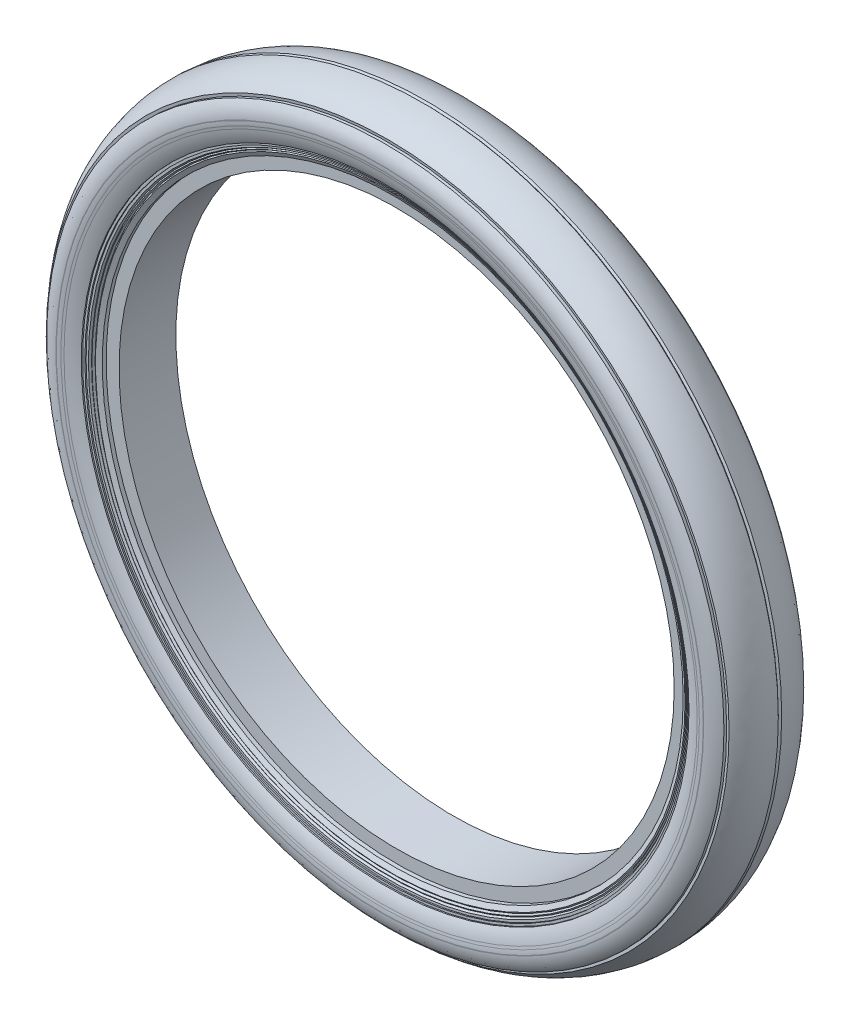
ISO-10303-21;
HEADER;
FILE_DESCRIPTION(('STEP AP214'),'2;1');
FILE_NAME('part.step','',(''),(''),'','','');
FILE_SCHEMA(('AUTOMOTIVE_DESIGN { 1 0 10303 214 1 1 1 1 }'));
ENDSEC;
DATA;
#1=APPLICATION_CONTEXT('core data for automotive mechanical design processes');
#2=APPLICATION_PROTOCOL_DEFINITION('international standard','automotive_design',2000,#1);
#3=PRODUCT_CONTEXT('',#1,'mechanical');
#4=PRODUCT('Part','Part','',(#3));
#5=PRODUCT_RELATED_PRODUCT_CATEGORY('part','',(#4));
#6=PRODUCT_DEFINITION_FORMATION('','',#4);
#7=PRODUCT_DEFINITION_CONTEXT('part definition',#1,'design');
#8=PRODUCT_DEFINITION('design','',#6,#7);
#9=PRODUCT_DEFINITION_SHAPE('','',#8);
#10=(LENGTH_UNIT() NAMED_UNIT(*) SI_UNIT(.MILLI.,.METRE.));
#11=(NAMED_UNIT(*) PLANE_ANGLE_UNIT() SI_UNIT($,.RADIAN.));
#12=(NAMED_UNIT(*) SI_UNIT($,.STERADIAN.) SOLID_ANGLE_UNIT());
#13=UNCERTAINTY_MEASURE_WITH_UNIT(LENGTH_MEASURE(1.E-05),#10,'distance_accuracy_value','');
#14=(GEOMETRIC_REPRESENTATION_CONTEXT(3) GLOBAL_UNCERTAINTY_ASSIGNED_CONTEXT((#13)) GLOBAL_UNIT_ASSIGNED_CONTEXT((#10,
#11,#12)) REPRESENTATION_CONTEXT('',''));
#15=CARTESIAN_POINT('',(0.,0.,0.));
#16=DIRECTION('',(0.,0.,1.));
#17=DIRECTION('',(1.,0.,0.));
#18=AXIS2_PLACEMENT_3D('',#15,#16,#17);
#19=CARTESIAN_POINT('',(0.,250.88266761477,0.));
#20=DIRECTION('',(1.,0.,0.));
#21=DIRECTION('',(0.,0.,1.));
#22=AXIS2_PLACEMENT_3D('',#19,#20,#21);
#23=ELLIPSE('',#22,35.,24.1173323852305);
#24=CARTESIAN_POINT('',(0.,0.,22.));
#25=DIRECTION('',(0.,0.,1.));
#26=AXIS1_PLACEMENT('',#24,#25);
#27=SURFACE_OF_REVOLUTION('',#23,#26);
#28=CARTESIAN_POINT('',(0.,0.,35.));
#29=DIRECTION('',(0.,0.,1.));
#30=DIRECTION('',(1.,0.,0.));
#31=AXIS2_PLACEMENT_3D('',#28,#29,#30);
#32=CIRCLE('',#31,250.88266761477);
#33=CARTESIAN_POINT('',(250.88266761477,0.,35.));
#34=VERTEX_POINT('',#33);
#35=EDGE_CURVE('E12',#34,#34,#32,.T.);
#36=ORIENTED_EDGE('',*,*,#35,.F.);
#37=EDGE_LOOP('',(#36));
#38=FACE_BOUND('',#37,.T.);
#39=CARTESIAN_POINT('',(0.,0.,30.7902092861246));
#40=DIRECTION('',(0.,0.,1.));
#41=DIRECTION('',(1.,0.,0.));
#42=AXIS2_PLACEMENT_3D('',#39,#40,#41);
#43=CIRCLE('',#42,262.350256403838);
#44=CARTESIAN_POINT('',(262.350256403838,0.,30.7902092861246));
#45=VERTEX_POINT('',#44);
#46=EDGE_CURVE('E168',#45,#45,#43,.T.);
#47=ORIENTED_EDGE('',*,*,#46,.T.);
#48=EDGE_LOOP('',(#47));
#49=FACE_BOUND('',#48,.T.);
#50=ADVANCED_FACE('F40',(#38,#49),#27,.T.);
#51=CARTESIAN_POINT('',(0.,250.88266761477,35.));
#52=DIRECTION('',(0.,0.,-1.));
#53=DIRECTION('',(-1.,0.,0.));
#54=AXIS2_PLACEMENT_3D('',#51,#52,#53);
#55=PLANE('',#54);
#56=CARTESIAN_POINT('',(0.,0.,35.));
#57=DIRECTION('',(0.,0.,1.));
#58=DIRECTION('',(1.,0.,0.));
#59=AXIS2_PLACEMENT_3D('',#56,#57,#58);
#60=CIRCLE('',#59,250.537268264597);
#61=CARTESIAN_POINT('',(250.537268264597,0.,35.));
#62=VERTEX_POINT('',#61);
#63=EDGE_CURVE('E47',#62,#62,#60,.T.);
#64=ORIENTED_EDGE('',*,*,#63,.F.);
#65=EDGE_LOOP('',(#64));
#66=FACE_BOUND('',#65,.T.);
#67=ORIENTED_EDGE('',*,*,#35,.T.);
#68=EDGE_LOOP('',(#67));
#69=FACE_BOUND('',#68,.T.);
#70=ADVANCED_FACE('F327',(#66,#69),#55,.F.);
#71=CARTESIAN_POINT('',(0.,0.,15.));
#72=DIRECTION('',(0.,0.,1.));
#73=DIRECTION('',(1.,0.,0.));
#74=AXIS2_PLACEMENT_3D('',#71,#72,#73);
#75=TOROIDAL_SURFACE('',#74,250.537268264597,20.);
#76=CARTESIAN_POINT('',(0.,0.,34.7280906865282));
#77=DIRECTION('',(0.,0.,1.));
#78=DIRECTION('',(1.,0.,0.));
#79=AXIS2_PLACEMENT_3D('',#76,#77,#78);
#80=CIRCLE('',#79,247.250562031281);
#81=CARTESIAN_POINT('',(247.250562031281,0.,34.7280906865282));
#82=VERTEX_POINT('',#81);
#83=EDGE_CURVE('E51',#82,#82,#80,.T.);
#84=ORIENTED_EDGE('',*,*,#83,.F.);
#85=EDGE_LOOP('',(#84));
#86=FACE_BOUND('',#85,.T.);
#87=ORIENTED_EDGE('',*,*,#63,.T.);
#88=EDGE_LOOP('',(#87));
#89=FACE_BOUND('',#88,.T.);
#90=ADVANCED_FACE('F324',(#86,#89),#75,.T.);
#91=CARTESIAN_POINT('',(0.,0.,34.7280906865282));
#92=DIRECTION('',(0.,0.,1.));
#93=DIRECTION('',(1.,0.,0.));
#94=AXIS2_PLACEMENT_3D('',#91,#92,#93);
#95=CONICAL_SURFACE('',#94,247.250562031281,1.40571220299879);
#96=CARTESIAN_POINT('',(0.,0.,34.3955866579208));
#97=DIRECTION('',(0.,0.,1.));
#98=DIRECTION('',(1.,0.,0.));
#99=AXIS2_PLACEMENT_3D('',#96,#97,#98);
#100=CIRCLE('',#99,245.254743371398);
#101=CARTESIAN_POINT('',(245.254743371398,0.,34.3955866579208));
#102=VERTEX_POINT('',#101);
#103=EDGE_CURVE('E55',#102,#102,#100,.T.);
#104=ORIENTED_EDGE('',*,*,#103,.F.);
#105=EDGE_LOOP('',(#104));
#106=FACE_BOUND('',#105,.T.);
#107=ORIENTED_EDGE('',*,*,#83,.T.);
#108=EDGE_LOOP('',(#107));
#109=FACE_BOUND('',#108,.T.);
#110=ADVANCED_FACE('F320',(#106,#109),#95,.F.);
#111=CARTESIAN_POINT('',(0.,0.,4.80345062812692));
#112=DIRECTION('',(0.,0.,1.));
#113=DIRECTION('',(1.,0.,0.));
#114=AXIS2_PLACEMENT_3D('',#111,#112,#113);
#115=TOROIDAL_SURFACE('',#114,250.184802721372,30.0000000000011);
#116=CARTESIAN_POINT('',(0.,0.,30.8890761680604));
#117=DIRECTION('',(0.,0.,1.));
#118=DIRECTION('',(1.,0.,0.));
#119=AXIS2_PLACEMENT_3D('',#116,#117,#118);
#120=CIRCLE('',#119,235.367915727458);
#121=CARTESIAN_POINT('',(235.367915727458,0.,30.8890761680604));
#122=VERTEX_POINT('',#121);
#123=EDGE_CURVE('E60',#122,#122,#120,.T.);
#124=ORIENTED_EDGE('',*,*,#123,.F.);
#125=EDGE_LOOP('',(#124));
#126=FACE_BOUND('',#125,.T.);
#127=ORIENTED_EDGE('',*,*,#103,.T.);
#128=EDGE_LOOP('',(#127));
#129=FACE_BOUND('',#128,.T.);
#130=ADVANCED_FACE('F316',(#126,#129),#115,.T.);
#131=CARTESIAN_POINT('',(0.,0.,22.));
#132=DIRECTION('',(0.,0.,1.));
#133=DIRECTION('',(1.,0.,0.));
#134=AXIS2_PLACEMENT_3D('',#131,#132,#133);
#135=CYLINDRICAL_SURFACE('',#134,235.367915727458);
#136=CARTESIAN_POINT('',(0.,0.,29.88907616806));
#137=DIRECTION('',(0.,0.,1.));
#138=DIRECTION('',(1.,0.,0.));
#139=AXIS2_PLACEMENT_3D('',#136,#137,#138);
#140=CIRCLE('',#139,235.367915727458);
#141=CARTESIAN_POINT('',(235.367915727458,0.,29.88907616806));
#142=VERTEX_POINT('',#141);
#143=EDGE_CURVE('E63',#142,#142,#140,.T.);
#144=ORIENTED_EDGE('',*,*,#143,.F.);
#145=EDGE_LOOP('',(#144));
#146=FACE_BOUND('',#145,.T.);
#147=ORIENTED_EDGE('',*,*,#123,.T.);
#148=EDGE_LOOP('',(#147));
#149=FACE_BOUND('',#148,.T.);
#150=ADVANCED_FACE('F312',(#146,#149),#135,.F.);
#151=CARTESIAN_POINT('',(0.,235.367915727458,29.8890761680604));
#152=DIRECTION('',(0.,0.,-1.));
#153=DIRECTION('',(-1.,0.,0.));
#154=AXIS2_PLACEMENT_3D('',#151,#152,#153);
#155=PLANE('',#154);
#156=CARTESIAN_POINT('',(0.,0.,29.8890761680608));
#157=DIRECTION('',(0.,0.,1.));
#158=DIRECTION('',(1.,0.,0.));
#159=AXIS2_PLACEMENT_3D('',#156,#157,#158);
#160=CIRCLE('',#159,233.60738225301);
#161=CARTESIAN_POINT('',(233.60738225301,0.,29.8890761680608));
#162=VERTEX_POINT('',#161);
#163=EDGE_CURVE('E66',#162,#162,#160,.T.);
#164=ORIENTED_EDGE('',*,*,#163,.F.);
#165=EDGE_LOOP('',(#164));
#166=FACE_BOUND('',#165,.T.);
#167=ORIENTED_EDGE('',*,*,#143,.T.);
#168=EDGE_LOOP('',(#167));
#169=FACE_BOUND('',#168,.T.);
#170=ADVANCED_FACE('F308',(#166,#169),#155,.F.);
#171=CARTESIAN_POINT('',(0.,0.,22.));
#172=DIRECTION('',(0.,0.,1.));
#173=DIRECTION('',(1.,0.,0.));
#174=AXIS2_PLACEMENT_3D('',#171,#172,#173);
#175=CYLINDRICAL_SURFACE('',#174,233.60738225301);
#176=CARTESIAN_POINT('',(0.,0.,28.8890761680608));
#177=DIRECTION('',(0.,0.,1.));
#178=DIRECTION('',(1.,0.,0.));
#179=AXIS2_PLACEMENT_3D('',#176,#177,#178);
#180=CIRCLE('',#179,233.60738225301);
#181=CARTESIAN_POINT('',(233.60738225301,0.,28.8890761680608));
#182=VERTEX_POINT('',#181);
#183=EDGE_CURVE('E69',#182,#182,#180,.T.);
#184=ORIENTED_EDGE('',*,*,#183,.F.);
#185=EDGE_LOOP('',(#184));
#186=FACE_BOUND('',#185,.T.);
#187=ORIENTED_EDGE('',*,*,#163,.T.);
#188=EDGE_LOOP('',(#187));
#189=FACE_BOUND('',#188,.T.);
#190=ADVANCED_FACE('F304',(#186,#189),#175,.F.);
#191=CARTESIAN_POINT('',(0.,233.60738225301,28.8890761680608));
#192=DIRECTION('',(0.,0.,-1.));
#193=DIRECTION('',(-1.,0.,0.));
#194=AXIS2_PLACEMENT_3D('',#191,#192,#193);
#195=PLANE('',#194);
#196=CARTESIAN_POINT('',(0.,0.,28.8890761680609));
#197=DIRECTION('',(0.,0.,1.));
#198=DIRECTION('',(1.,0.,0.));
#199=AXIS2_PLACEMENT_3D('',#196,#197,#198);
#200=CIRCLE('',#199,231.846848778559);
#201=CARTESIAN_POINT('',(231.846848778559,0.,28.8890761680609));
#202=VERTEX_POINT('',#201);
#203=EDGE_CURVE('E72',#202,#202,#200,.T.);
#204=ORIENTED_EDGE('',*,*,#203,.F.);
#205=EDGE_LOOP('',(#204));
#206=FACE_BOUND('',#205,.T.);
#207=ORIENTED_EDGE('',*,*,#183,.T.);
#208=EDGE_LOOP('',(#207));
#209=FACE_BOUND('',#208,.T.);
#210=ADVANCED_FACE('F300',(#206,#209),#195,.F.);
#211=CARTESIAN_POINT('',(0.,0.,28.8890761680609));
#212=DIRECTION('',(0.,0.,1.));
#213=DIRECTION('',(1.,0.,0.));
#214=AXIS2_PLACEMENT_3D('',#211,#212,#213);
#215=CONICAL_SURFACE('',#214,231.846848778559,0.537666373477924);
#216=CARTESIAN_POINT('',(0.,0.,27.3769431462616));
#217=DIRECTION('',(0.,0.,1.));
#218=DIRECTION('',(1.,0.,0.));
#219=AXIS2_PLACEMENT_3D('',#216,#217,#218);
#220=CIRCLE('',#219,230.94522145031);
#221=CARTESIAN_POINT('',(230.94522145031,0.,27.3769431462616));
#222=VERTEX_POINT('',#221);
#223=EDGE_CURVE('E75',#222,#222,#220,.T.);
#224=ORIENTED_EDGE('',*,*,#223,.F.);
#225=EDGE_LOOP('',(#224));
#226=FACE_BOUND('',#225,.T.);
#227=ORIENTED_EDGE('',*,*,#203,.T.);
#228=EDGE_LOOP('',(#227));
#229=FACE_BOUND('',#228,.T.);
#230=ADVANCED_FACE('F296',(#226,#229),#215,.F.);
#231=CARTESIAN_POINT('',(0.,0.,27.3769431462616));
#232=DIRECTION('',(0.,0.,-1.));
#233=DIRECTION('',(-1.,0.,0.));
#234=AXIS2_PLACEMENT_3D('',#231,#232,#233);
#235=CONICAL_SURFACE('',#234,230.94522145031,1.03312995331698);
#236=CARTESIAN_POINT('',(0.,0.,27.8890761680609));
#237=DIRECTION('',(0.,0.,1.));
#238=DIRECTION('',(1.,0.,0.));
#239=AXIS2_PLACEMENT_3D('',#236,#237,#238);
#240=CIRCLE('',#239,230.086315304109);
#241=CARTESIAN_POINT('',(230.086315304109,0.,27.8890761680609));
#242=VERTEX_POINT('',#241);
#243=EDGE_CURVE('E78',#242,#242,#240,.T.);
#244=ORIENTED_EDGE('',*,*,#243,.F.);
#245=EDGE_LOOP('',(#244));
#246=FACE_BOUND('',#245,.T.);
#247=ORIENTED_EDGE('',*,*,#223,.T.);
#248=EDGE_LOOP('',(#247));
#249=FACE_BOUND('',#248,.T.);
#250=ADVANCED_FACE('F292',(#246,#249),#235,.T.);
#251=CARTESIAN_POINT('',(0.,0.,27.8890761680609));
#252=DIRECTION('',(0.,0.,1.));
#253=DIRECTION('',(1.,0.,0.));
#254=AXIS2_PLACEMENT_3D('',#251,#252,#253);
#255=CONICAL_SURFACE('',#254,230.086315304109,0.537666373477914);
#256=CARTESIAN_POINT('',(0.,0.,26.3769431462619));
#257=DIRECTION('',(0.,0.,1.));
#258=DIRECTION('',(1.,0.,0.));
#259=AXIS2_PLACEMENT_3D('',#256,#257,#258);
#260=CIRCLE('',#259,229.18468797586);
#261=CARTESIAN_POINT('',(229.18468797586,0.,26.3769431462619));
#262=VERTEX_POINT('',#261);
#263=EDGE_CURVE('E81',#262,#262,#260,.T.);
#264=ORIENTED_EDGE('',*,*,#263,.F.);
#265=EDGE_LOOP('',(#264));
#266=FACE_BOUND('',#265,.T.);
#267=ORIENTED_EDGE('',*,*,#243,.T.);
#268=EDGE_LOOP('',(#267));
#269=FACE_BOUND('',#268,.T.);
#270=ADVANCED_FACE('F288',(#266,#269),#255,.F.);
#271=CARTESIAN_POINT('',(0.,0.,26.3769431462619));
#272=DIRECTION('',(0.,0.,-1.));
#273=DIRECTION('',(-1.,0.,0.));
#274=AXIS2_PLACEMENT_3D('',#271,#272,#273);
#275=CONICAL_SURFACE('',#274,229.18468797586,1.03312995331694);
#276=CARTESIAN_POINT('',(0.,0.,26.8890761680611));
#277=DIRECTION('',(0.,0.,1.));
#278=DIRECTION('',(1.,0.,0.));
#279=AXIS2_PLACEMENT_3D('',#276,#277,#278);
#280=CIRCLE('',#279,228.325781829658);
#281=CARTESIAN_POINT('',(228.325781829658,0.,26.8890761680611));
#282=VERTEX_POINT('',#281);
#283=EDGE_CURVE('E84',#282,#282,#280,.T.);
#284=ORIENTED_EDGE('',*,*,#283,.F.);
#285=EDGE_LOOP('',(#284));
#286=FACE_BOUND('',#285,.T.);
#287=ORIENTED_EDGE('',*,*,#263,.T.);
#288=EDGE_LOOP('',(#287));
#289=FACE_BOUND('',#288,.T.);
#290=ADVANCED_FACE('F284',(#286,#289),#275,.T.);
#291=CARTESIAN_POINT('',(0.,0.,26.8890761680611));
#292=DIRECTION('',(0.,0.,1.));
#293=DIRECTION('',(1.,0.,0.));
#294=AXIS2_PLACEMENT_3D('',#291,#292,#293);
#295=CONICAL_SURFACE('',#294,228.325781829658,1.05423135013636);
#296=CARTESIAN_POINT('',(0.,0.,25.));
#297=DIRECTION('',(0.,0.,1.));
#298=DIRECTION('',(1.,0.,0.));
#299=AXIS2_PLACEMENT_3D('',#296,#297,#298);
#300=CIRCLE('',#299,225.);
#301=CARTESIAN_POINT('',(225.,0.,25.));
#302=VERTEX_POINT('',#301);
#303=EDGE_CURVE('E87',#302,#302,#300,.T.);
#304=ORIENTED_EDGE('',*,*,#303,.F.);
#305=EDGE_LOOP('',(#304));
#306=FACE_BOUND('',#305,.T.);
#307=ORIENTED_EDGE('',*,*,#283,.T.);
#308=EDGE_LOOP('',(#307));
#309=FACE_BOUND('',#308,.T.);
#310=ADVANCED_FACE('F280',(#306,#309),#295,.F.);
#311=CARTESIAN_POINT('',(0.,0.,22.));
#312=DIRECTION('',(0.,0.,1.));
#313=DIRECTION('',(1.,0.,0.));
#314=AXIS2_PLACEMENT_3D('',#311,#312,#313);
#315=CYLINDRICAL_SURFACE('',#314,225.);
#316=CARTESIAN_POINT('',(0.,0.,22.));
#317=DIRECTION('',(0.,0.,1.));
#318=DIRECTION('',(1.,0.,0.));
#319=AXIS2_PLACEMENT_3D('',#316,#317,#318);
#320=CIRCLE('',#319,225.);
#321=CARTESIAN_POINT('',(225.,0.,22.));
#322=VERTEX_POINT('',#321);
#323=EDGE_CURVE('E90',#322,#322,#320,.T.);
#324=ORIENTED_EDGE('',*,*,#323,.F.);
#325=EDGE_LOOP('',(#324));
#326=FACE_BOUND('',#325,.T.);
#327=ORIENTED_EDGE('',*,*,#303,.T.);
#328=EDGE_LOOP('',(#327));
#329=FACE_BOUND('',#328,.T.);
#330=ADVANCED_FACE('F276',(#326,#329),#315,.F.);
#331=CARTESIAN_POINT('',(0.,215.,22.));
#332=DIRECTION('',(0.,0.,-1.));
#333=DIRECTION('',(-1.,0.,0.));
#334=AXIS2_PLACEMENT_3D('',#331,#332,#333);
#335=PLANE('',#334);
#336=CARTESIAN_POINT('',(0.,0.,22.));
#337=DIRECTION('',(0.,0.,1.));
#338=DIRECTION('',(1.,0.,0.));
#339=AXIS2_PLACEMENT_3D('',#336,#337,#338);
#340=CIRCLE('',#339,215.);
#341=CARTESIAN_POINT('',(215.,0.,22.));
#342=VERTEX_POINT('',#341);
#343=EDGE_CURVE('E93',#342,#342,#340,.T.);
#344=ORIENTED_EDGE('',*,*,#343,.F.);
#345=EDGE_LOOP('',(#344));
#346=FACE_BOUND('',#345,.T.);
#347=ORIENTED_EDGE('',*,*,#323,.T.);
#348=EDGE_LOOP('',(#347));
#349=FACE_BOUND('',#348,.T.);
#350=ADVANCED_FACE('F272',(#346,#349),#335,.F.);
#351=CARTESIAN_POINT('',(0.,0.,22.));
#352=DIRECTION('',(0.,0.,1.));
#353=DIRECTION('',(1.,0.,0.));
#354=AXIS2_PLACEMENT_3D('',#351,#352,#353);
#355=CYLINDRICAL_SURFACE('',#354,215.);
#356=CARTESIAN_POINT('',(0.,0.,-22.));
#357=DIRECTION('',(0.,0.,1.));
#358=DIRECTION('',(1.,0.,0.));
#359=AXIS2_PLACEMENT_3D('',#356,#357,#358);
#360=CIRCLE('',#359,215.);
#361=CARTESIAN_POINT('',(215.,0.,-22.));
#362=VERTEX_POINT('',#361);
#363=EDGE_CURVE('E96',#362,#362,#360,.T.);
#364=ORIENTED_EDGE('',*,*,#363,.F.);
#365=EDGE_LOOP('',(#364));
#366=FACE_BOUND('',#365,.T.);
#367=ORIENTED_EDGE('',*,*,#343,.T.);
#368=EDGE_LOOP('',(#367));
#369=FACE_BOUND('',#368,.T.);
#370=ADVANCED_FACE('F268',(#366,#369),#355,.F.);
#371=CARTESIAN_POINT('',(0.,215.,-22.));
#372=DIRECTION('',(0.,0.,1.));
#373=DIRECTION('',(1.,0.,0.));
#374=AXIS2_PLACEMENT_3D('',#371,#372,#373);
#375=PLANE('',#374);
#376=CARTESIAN_POINT('',(0.,0.,-22.));
#377=DIRECTION('',(0.,0.,1.));
#378=DIRECTION('',(1.,0.,0.));
#379=AXIS2_PLACEMENT_3D('',#376,#377,#378);
#380=CIRCLE('',#379,225.);
#381=CARTESIAN_POINT('',(225.,0.,-22.));
#382=VERTEX_POINT('',#381);
#383=EDGE_CURVE('E99',#382,#382,#380,.T.);
#384=ORIENTED_EDGE('',*,*,#383,.F.);
#385=EDGE_LOOP('',(#384));
#386=FACE_BOUND('',#385,.T.);
#387=ORIENTED_EDGE('',*,*,#363,.T.);
#388=EDGE_LOOP('',(#387));
#389=FACE_BOUND('',#388,.T.);
#390=ADVANCED_FACE('F264',(#386,#389),#375,.F.);
#391=CARTESIAN_POINT('',(0.,0.,22.));
#392=DIRECTION('',(0.,0.,1.));
#393=DIRECTION('',(1.,0.,0.));
#394=AXIS2_PLACEMENT_3D('',#391,#392,#393);
#395=CYLINDRICAL_SURFACE('',#394,225.);
#396=CARTESIAN_POINT('',(0.,0.,-25.));
#397=DIRECTION('',(0.,0.,1.));
#398=DIRECTION('',(1.,0.,0.));
#399=AXIS2_PLACEMENT_3D('',#396,#397,#398);
#400=CIRCLE('',#399,225.);
#401=CARTESIAN_POINT('',(225.,0.,-25.));
#402=VERTEX_POINT('',#401);
#403=EDGE_CURVE('E102',#402,#402,#400,.T.);
#404=ORIENTED_EDGE('',*,*,#403,.F.);
#405=EDGE_LOOP('',(#404));
#406=FACE_BOUND('',#405,.T.);
#407=ORIENTED_EDGE('',*,*,#383,.T.);
#408=EDGE_LOOP('',(#407));
#409=FACE_BOUND('',#408,.T.);
#410=ADVANCED_FACE('F260',(#406,#409),#395,.F.);
#411=CARTESIAN_POINT('',(0.,0.,-25.));
#412=DIRECTION('',(0.,0.,-1.));
#413=DIRECTION('',(-1.,0.,0.));
#414=AXIS2_PLACEMENT_3D('',#411,#412,#413);
#415=CONICAL_SURFACE('',#414,225.,1.05423135013642);
#416=CARTESIAN_POINT('',(0.,0.,-26.8890761680609));
#417=DIRECTION('',(0.,0.,1.));
#418=DIRECTION('',(1.,0.,0.));
#419=AXIS2_PLACEMENT_3D('',#416,#417,#418);
#420=CIRCLE('',#419,228.325781829658);
#421=CARTESIAN_POINT('',(228.325781829658,0.,-26.8890761680609));
#422=VERTEX_POINT('',#421);
#423=EDGE_CURVE('E105',#422,#422,#420,.T.);
#424=ORIENTED_EDGE('',*,*,#423,.F.);
#425=EDGE_LOOP('',(#424));
#426=FACE_BOUND('',#425,.T.);
#427=ORIENTED_EDGE('',*,*,#403,.T.);
#428=EDGE_LOOP('',(#427));
#429=FACE_BOUND('',#428,.T.);
#430=ADVANCED_FACE('F256',(#426,#429),#415,.F.);
#431=CARTESIAN_POINT('',(0.,0.,-26.8890761680609));
#432=DIRECTION('',(0.,0.,1.));
#433=DIRECTION('',(1.,0.,0.));
#434=AXIS2_PLACEMENT_3D('',#431,#432,#433);
#435=CONICAL_SURFACE('',#434,228.325781829658,1.03312995331687);
#436=CARTESIAN_POINT('',(0.,0.,-26.3769431462616));
#437=DIRECTION('',(0.,0.,1.));
#438=DIRECTION('',(1.,0.,0.));
#439=AXIS2_PLACEMENT_3D('',#436,#437,#438);
#440=CIRCLE('',#439,229.18468797586);
#441=CARTESIAN_POINT('',(229.18468797586,0.,-26.3769431462616));
#442=VERTEX_POINT('',#441);
#443=EDGE_CURVE('E108',#442,#442,#440,.T.);
#444=ORIENTED_EDGE('',*,*,#443,.F.);
#445=EDGE_LOOP('',(#444));
#446=FACE_BOUND('',#445,.T.);
#447=ORIENTED_EDGE('',*,*,#423,.T.);
#448=EDGE_LOOP('',(#447));
#449=FACE_BOUND('',#448,.T.);
#450=ADVANCED_FACE('F252',(#446,#449),#435,.T.);
#451=CARTESIAN_POINT('',(0.,0.,-26.3769431462616));
#452=DIRECTION('',(0.,0.,-1.));
#453=DIRECTION('',(-1.,0.,0.));
#454=AXIS2_PLACEMENT_3D('',#451,#452,#453);
#455=CONICAL_SURFACE('',#454,229.18468797586,0.537666373477923);
#456=CARTESIAN_POINT('',(0.,0.,-27.8890761680609));
#457=DIRECTION('',(0.,0.,1.));
#458=DIRECTION('',(1.,0.,0.));
#459=AXIS2_PLACEMENT_3D('',#456,#457,#458);
#460=CIRCLE('',#459,230.086315304109);
#461=CARTESIAN_POINT('',(230.086315304109,0.,-27.8890761680609));
#462=VERTEX_POINT('',#461);
#463=EDGE_CURVE('E111',#462,#462,#460,.T.);
#464=ORIENTED_EDGE('',*,*,#463,.F.);
#465=EDGE_LOOP('',(#464));
#466=FACE_BOUND('',#465,.T.);
#467=ORIENTED_EDGE('',*,*,#443,.T.);
#468=EDGE_LOOP('',(#467));
#469=FACE_BOUND('',#468,.T.);
#470=ADVANCED_FACE('F248',(#466,#469),#455,.F.);
#471=CARTESIAN_POINT('',(0.,0.,-27.8890761680609));
#472=DIRECTION('',(0.,0.,1.));
#473=DIRECTION('',(1.,0.,0.));
#474=AXIS2_PLACEMENT_3D('',#471,#472,#473);
#475=CONICAL_SURFACE('',#474,230.086315304109,1.03312995331698);
#476=CARTESIAN_POINT('',(0.,0.,-27.3769431462617));
#477=DIRECTION('',(0.,0.,1.));
#478=DIRECTION('',(1.,0.,0.));
#479=AXIS2_PLACEMENT_3D('',#476,#477,#478);
#480=CIRCLE('',#479,230.94522145031);
#481=CARTESIAN_POINT('',(230.94522145031,0.,-27.3769431462617));
#482=VERTEX_POINT('',#481);
#483=EDGE_CURVE('E114',#482,#482,#480,.T.);
#484=ORIENTED_EDGE('',*,*,#483,.F.);
#485=EDGE_LOOP('',(#484));
#486=FACE_BOUND('',#485,.T.);
#487=ORIENTED_EDGE('',*,*,#463,.T.);
#488=EDGE_LOOP('',(#487));
#489=FACE_BOUND('',#488,.T.);
#490=ADVANCED_FACE('F244',(#486,#489),#475,.T.);
#491=CARTESIAN_POINT('',(0.,0.,-27.3769431462617));
#492=DIRECTION('',(0.,0.,-1.));
#493=DIRECTION('',(-1.,0.,0.));
#494=AXIS2_PLACEMENT_3D('',#491,#492,#493);
#495=CONICAL_SURFACE('',#494,230.94522145031,0.537666373477923);
#496=CARTESIAN_POINT('',(0.,0.,-28.8890761680609));
#497=DIRECTION('',(0.,0.,1.));
#498=DIRECTION('',(1.,0.,0.));
#499=AXIS2_PLACEMENT_3D('',#496,#497,#498);
#500=CIRCLE('',#499,231.84684877856);
#501=CARTESIAN_POINT('',(231.84684877856,0.,-28.8890761680609));
#502=VERTEX_POINT('',#501);
#503=EDGE_CURVE('E117',#502,#502,#500,.T.);
#504=ORIENTED_EDGE('',*,*,#503,.F.);
#505=EDGE_LOOP('',(#504));
#506=FACE_BOUND('',#505,.T.);
#507=ORIENTED_EDGE('',*,*,#483,.T.);
#508=EDGE_LOOP('',(#507));
#509=FACE_BOUND('',#508,.T.);
#510=ADVANCED_FACE('F240',(#506,#509),#495,.F.);
#511=CARTESIAN_POINT('',(0.,233.60738225301,-28.8890761680609));
#512=DIRECTION('',(0.,0.,1.));
#513=DIRECTION('',(1.,0.,0.));
#514=AXIS2_PLACEMENT_3D('',#511,#512,#513);
#515=PLANE('',#514);
#516=CARTESIAN_POINT('',(0.,0.,-28.8890761680609));
#517=DIRECTION('',(0.,0.,1.));
#518=DIRECTION('',(1.,0.,0.));
#519=AXIS2_PLACEMENT_3D('',#516,#517,#518);
#520=CIRCLE('',#519,233.60738225301);
#521=CARTESIAN_POINT('',(233.60738225301,0.,-28.8890761680609));
#522=VERTEX_POINT('',#521);
#523=EDGE_CURVE('E120',#522,#522,#520,.T.);
#524=ORIENTED_EDGE('',*,*,#523,.F.);
#525=EDGE_LOOP('',(#524));
#526=FACE_BOUND('',#525,.T.);
#527=ORIENTED_EDGE('',*,*,#503,.T.);
#528=EDGE_LOOP('',(#527));
#529=FACE_BOUND('',#528,.T.);
#530=ADVANCED_FACE('F236',(#526,#529),#515,.F.);
#531=CARTESIAN_POINT('',(0.,0.,22.));
#532=DIRECTION('',(0.,0.,1.));
#533=DIRECTION('',(1.,0.,0.));
#534=AXIS2_PLACEMENT_3D('',#531,#532,#533);
#535=CYLINDRICAL_SURFACE('',#534,233.60738225301);
#536=CARTESIAN_POINT('',(0.,0.,-29.8890761680609));
#537=DIRECTION('',(0.,0.,1.));
#538=DIRECTION('',(1.,0.,0.));
#539=AXIS2_PLACEMENT_3D('',#536,#537,#538);
#540=CIRCLE('',#539,233.60738225301);
#541=CARTESIAN_POINT('',(233.60738225301,0.,-29.8890761680609));
#542=VERTEX_POINT('',#541);
#543=EDGE_CURVE('E123',#542,#542,#540,.T.);
#544=ORIENTED_EDGE('',*,*,#543,.F.);
#545=EDGE_LOOP('',(#544));
#546=FACE_BOUND('',#545,.T.);
#547=ORIENTED_EDGE('',*,*,#523,.T.);
#548=EDGE_LOOP('',(#547));
#549=FACE_BOUND('',#548,.T.);
#550=ADVANCED_FACE('F232',(#546,#549),#535,.F.);
#551=CARTESIAN_POINT('',(0.,235.367915727458,-29.8890761680608));
#552=DIRECTION('',(0.,0.,1.));
#553=DIRECTION('',(1.,0.,0.));
#554=AXIS2_PLACEMENT_3D('',#551,#552,#553);
#555=PLANE('',#554);
#556=CARTESIAN_POINT('',(0.,0.,-29.8890761680608));
#557=DIRECTION('',(0.,0.,1.));
#558=DIRECTION('',(1.,0.,0.));
#559=AXIS2_PLACEMENT_3D('',#556,#557,#558);
#560=CIRCLE('',#559,235.367915727458);
#561=CARTESIAN_POINT('',(235.367915727458,0.,-29.8890761680608));
#562=VERTEX_POINT('',#561);
#563=EDGE_CURVE('E126',#562,#562,#560,.T.);
#564=ORIENTED_EDGE('',*,*,#563,.F.);
#565=EDGE_LOOP('',(#564));
#566=FACE_BOUND('',#565,.T.);
#567=ORIENTED_EDGE('',*,*,#543,.T.);
#568=EDGE_LOOP('',(#567));
#569=FACE_BOUND('',#568,.T.);
#570=ADVANCED_FACE('F228',(#566,#569),#555,.F.);
#571=CARTESIAN_POINT('',(0.,0.,22.));
#572=DIRECTION('',(0.,0.,1.));
#573=DIRECTION('',(1.,0.,0.));
#574=AXIS2_PLACEMENT_3D('',#571,#572,#573);
#575=CYLINDRICAL_SURFACE('',#574,235.367915727458);
#576=CARTESIAN_POINT('',(0.,0.,-30.8890761680608));
#577=DIRECTION('',(0.,0.,1.));
#578=DIRECTION('',(1.,0.,0.));
#579=AXIS2_PLACEMENT_3D('',#576,#577,#578);
#580=CIRCLE('',#579,235.367915727458);
#581=CARTESIAN_POINT('',(235.367915727458,0.,-30.8890761680608));
#582=VERTEX_POINT('',#581);
#583=EDGE_CURVE('E129',#582,#582,#580,.T.);
#584=ORIENTED_EDGE('',*,*,#583,.F.);
#585=EDGE_LOOP('',(#584));
#586=FACE_BOUND('',#585,.T.);
#587=ORIENTED_EDGE('',*,*,#563,.T.);
#588=EDGE_LOOP('',(#587));
#589=FACE_BOUND('',#588,.T.);
#590=ADVANCED_FACE('F224',(#586,#589),#575,.F.);
#591=CARTESIAN_POINT('',(0.,0.,-4.80345062812692));
#592=DIRECTION('',(0.,0.,1.));
#593=DIRECTION('',(1.,0.,0.));
#594=AXIS2_PLACEMENT_3D('',#591,#592,#593);
#595=TOROIDAL_SURFACE('',#594,250.184802721372,30.0000000000016);
#596=CARTESIAN_POINT('',(0.,0.,-34.3955866579208));
#597=DIRECTION('',(0.,0.,1.));
#598=DIRECTION('',(1.,0.,0.));
#599=AXIS2_PLACEMENT_3D('',#596,#597,#598);
#600=CIRCLE('',#599,245.254743371398);
#601=CARTESIAN_POINT('',(245.254743371398,0.,-34.3955866579208));
#602=VERTEX_POINT('',#601);
#603=EDGE_CURVE('E132',#602,#602,#600,.T.);
#604=ORIENTED_EDGE('',*,*,#603,.F.);
#605=EDGE_LOOP('',(#604));
#606=FACE_BOUND('',#605,.T.);
#607=ORIENTED_EDGE('',*,*,#583,.T.);
#608=EDGE_LOOP('',(#607));
#609=FACE_BOUND('',#608,.T.);
#610=ADVANCED_FACE('F220',(#606,#609),#595,.T.);
#611=CARTESIAN_POINT('',(0.,0.,-34.3955866579208));
#612=DIRECTION('',(0.,0.,-1.));
#613=DIRECTION('',(-1.,0.,0.));
#614=AXIS2_PLACEMENT_3D('',#611,#612,#613);
#615=CONICAL_SURFACE('',#614,245.254743371398,1.40571220299879);
#616=CARTESIAN_POINT('',(0.,0.,-34.7280906865282));
#617=DIRECTION('',(0.,0.,1.));
#618=DIRECTION('',(1.,0.,0.));
#619=AXIS2_PLACEMENT_3D('',#616,#617,#618);
#620=CIRCLE('',#619,247.250562031281);
#621=CARTESIAN_POINT('',(247.250562031281,0.,-34.7280906865282));
#622=VERTEX_POINT('',#621);
#623=EDGE_CURVE('E135',#622,#622,#620,.T.);
#624=ORIENTED_EDGE('',*,*,#623,.F.);
#625=EDGE_LOOP('',(#624));
#626=FACE_BOUND('',#625,.T.);
#627=ORIENTED_EDGE('',*,*,#603,.T.);
#628=EDGE_LOOP('',(#627));
#629=FACE_BOUND('',#628,.T.);
#630=ADVANCED_FACE('F216',(#626,#629),#615,.F.);
#631=CARTESIAN_POINT('',(0.,0.,-15.));
#632=DIRECTION('',(0.,0.,1.));
#633=DIRECTION('',(1.,0.,0.));
#634=AXIS2_PLACEMENT_3D('',#631,#632,#633);
#635=TOROIDAL_SURFACE('',#634,250.537268264597,20.);
#636=CARTESIAN_POINT('',(0.,0.,-35.));
#637=DIRECTION('',(0.,0.,1.));
#638=DIRECTION('',(1.,0.,0.));
#639=AXIS2_PLACEMENT_3D('',#636,#637,#638);
#640=CIRCLE('',#639,250.537268264597);
#641=CARTESIAN_POINT('',(250.537268264597,0.,-35.));
#642=VERTEX_POINT('',#641);
#643=EDGE_CURVE('E138',#642,#642,#640,.T.);
#644=ORIENTED_EDGE('',*,*,#643,.F.);
#645=EDGE_LOOP('',(#644));
#646=FACE_BOUND('',#645,.T.);
#647=ORIENTED_EDGE('',*,*,#623,.T.);
#648=EDGE_LOOP('',(#647));
#649=FACE_BOUND('',#648,.T.);
#650=ADVANCED_FACE('F212',(#646,#649),#635,.T.);
#651=CARTESIAN_POINT('',(0.,250.88266761477,-35.));
#652=DIRECTION('',(0.,0.,1.));
#653=DIRECTION('',(1.,0.,0.));
#654=AXIS2_PLACEMENT_3D('',#651,#652,#653);
#655=PLANE('',#654);
#656=CARTESIAN_POINT('',(0.,0.,-35.));
#657=DIRECTION('',(0.,0.,1.));
#658=DIRECTION('',(1.,0.,0.));
#659=AXIS2_PLACEMENT_3D('',#656,#657,#658);
#660=CIRCLE('',#659,250.88266761477);
#661=CARTESIAN_POINT('',(250.88266761477,0.,-35.));
#662=VERTEX_POINT('',#661);
#663=EDGE_CURVE('E141',#662,#662,#660,.T.);
#664=ORIENTED_EDGE('',*,*,#663,.F.);
#665=EDGE_LOOP('',(#664));
#666=FACE_BOUND('',#665,.T.);
#667=ORIENTED_EDGE('',*,*,#643,.T.);
#668=EDGE_LOOP('',(#667));
#669=FACE_BOUND('',#668,.T.);
#670=ADVANCED_FACE('F206',(#666,#669),#655,.F.);
#671=CARTESIAN_POINT('',(0.,250.88266761477,0.));
#672=DIRECTION('',(1.,0.,0.));
#673=DIRECTION('',(0.,0.,1.));
#674=AXIS2_PLACEMENT_3D('',#671,#672,#673);
#675=ELLIPSE('',#674,35.,24.1173323852305);
#676=CARTESIAN_POINT('',(0.,0.,22.));
#677=DIRECTION('',(0.,0.,1.));
#678=AXIS1_PLACEMENT('',#676,#677);
#679=SURFACE_OF_REVOLUTION('',#675,#678);
#680=CARTESIAN_POINT('',(0.,0.,-30.7902092861246));
#681=DIRECTION('',(0.,0.,1.));
#682=DIRECTION('',(1.,0.,0.));
#683=AXIS2_PLACEMENT_3D('',#680,#681,#682);
#684=CIRCLE('',#683,262.350256403838);
#685=CARTESIAN_POINT('',(262.350256403838,0.,-30.7902092861246));
#686=VERTEX_POINT('',#685);
#687=EDGE_CURVE('E144',#686,#686,#684,.T.);
#688=ORIENTED_EDGE('',*,*,#687,.F.);
#689=EDGE_LOOP('',(#688));
#690=FACE_BOUND('',#689,.T.);
#691=ORIENTED_EDGE('',*,*,#663,.T.);
#692=EDGE_LOOP('',(#691));
#693=FACE_BOUND('',#692,.T.);
#694=ADVANCED_FACE('F202',(#690,#693),#679,.T.);
#695=CARTESIAN_POINT('',(0.,0.,22.));
#696=DIRECTION('',(0.,0.,1.));
#697=DIRECTION('',(1.,0.,0.));
#698=AXIS2_PLACEMENT_3D('',#695,#696,#697);
#699=CYLINDRICAL_SURFACE('',#698,262.350256403838);
#700=CARTESIAN_POINT('',(0.,0.,-28.6664738111187));
#701=DIRECTION('',(0.,0.,1.));
#702=DIRECTION('',(1.,0.,0.));
#703=AXIS2_PLACEMENT_3D('',#700,#701,#702);
#704=CIRCLE('',#703,262.350256403838);
#705=CARTESIAN_POINT('',(262.350256403838,0.,-28.6664738111187));
#706=VERTEX_POINT('',#705);
#707=EDGE_CURVE('E147',#706,#706,#704,.T.);
#708=ORIENTED_EDGE('',*,*,#707,.F.);
#709=EDGE_LOOP('',(#708));
#710=FACE_BOUND('',#709,.T.);
#711=ORIENTED_EDGE('',*,*,#687,.T.);
#712=EDGE_LOOP('',(#711));
#713=FACE_BOUND('',#712,.T.);
#714=ADVANCED_FACE('F198',(#710,#713),#699,.T.);
#715=CARTESIAN_POINT('',(0.,0.,-28.6664738111187));
#716=DIRECTION('',(0.,0.,-1.));
#717=DIRECTION('',(-1.,0.,0.));
#718=AXIS2_PLACEMENT_3D('',#715,#716,#717);
#719=CONICAL_SURFACE('',#718,262.350256403838,1.44760530563248);
#720=CARTESIAN_POINT('',(0.,0.,-28.9275879449187));
#721=DIRECTION('',(0.,0.,1.));
#722=DIRECTION('',(1.,0.,0.));
#723=AXIS2_PLACEMENT_3D('',#720,#721,#722);
#724=CIRCLE('',#723,264.459110614528);
#725=CARTESIAN_POINT('',(264.459110614528,0.,-28.9275879449187));
#726=VERTEX_POINT('',#725);
#727=EDGE_CURVE('E150',#726,#726,#724,.T.);
#728=ORIENTED_EDGE('',*,*,#727,.F.);
#729=EDGE_LOOP('',(#728));
#730=FACE_BOUND('',#729,.T.);
#731=ORIENTED_EDGE('',*,*,#707,.T.);
#732=EDGE_LOOP('',(#731));
#733=FACE_BOUND('',#732,.T.);
#734=ADVANCED_FACE('F194',(#730,#733),#719,.F.);
#735=CARTESIAN_POINT('',(0.,250.88266761477,0.));
#736=DIRECTION('',(1.,0.,0.));
#737=DIRECTION('',(0.,0.,1.));
#738=AXIS2_PLACEMENT_3D('',#735,#736,#737);
#739=ELLIPSE('',#738,35.,24.1173323852305);
#740=CARTESIAN_POINT('',(0.,0.,22.));
#741=DIRECTION('',(0.,0.,1.));
#742=AXIS1_PLACEMENT('',#740,#741);
#743=SURFACE_OF_REVOLUTION('',#739,#742);
#744=CARTESIAN_POINT('',(0.,0.,-1.31322776334947));
#745=DIRECTION('',(0.,0.,1.));
#746=DIRECTION('',(1.,0.,0.));
#747=AXIS2_PLACEMENT_3D('',#744,#745,#746);
#748=CIRCLE('',#747,274.983017710985);
#749=CARTESIAN_POINT('',(274.983017710985,0.,-1.31322776334947));
#750=VERTEX_POINT('',#749);
#751=EDGE_CURVE('E153',#750,#750,#748,.T.);
#752=ORIENTED_EDGE('',*,*,#751,.F.);
#753=EDGE_LOOP('',(#752));
#754=FACE_BOUND('',#753,.T.);
#755=ORIENTED_EDGE('',*,*,#727,.T.);
#756=EDGE_LOOP('',(#755));
#757=FACE_BOUND('',#756,.T.);
#758=ADVANCED_FACE('F190',(#754,#757),#743,.T.);
#759=CARTESIAN_POINT('',(0.,0.,-1.31322776334947));
#760=DIRECTION('',(0.,0.,-1.));
#761=DIRECTION('',(-1.,0.,0.));
#762=AXIS2_PLACEMENT_3D('',#759,#760,#761);
#763=CONICAL_SURFACE('',#762,274.983017710985,0.785398163397447);
#764=CARTESIAN_POINT('',(0.,0.,0.));
#765=DIRECTION('',(0.,0.,1.));
#766=DIRECTION('',(1.,0.,0.));
#767=AXIS2_PLACEMENT_3D('',#764,#765,#766);
#768=CIRCLE('',#767,273.669789947635);
#769=CARTESIAN_POINT('',(273.669789947635,0.,0.));
#770=VERTEX_POINT('',#769);
#771=EDGE_CURVE('E156',#770,#770,#768,.T.);
#772=ORIENTED_EDGE('',*,*,#771,.F.);
#773=EDGE_LOOP('',(#772));
#774=FACE_BOUND('',#773,.T.);
#775=ORIENTED_EDGE('',*,*,#751,.T.);
#776=EDGE_LOOP('',(#775));
#777=FACE_BOUND('',#776,.T.);
#778=ADVANCED_FACE('F186',(#774,#777),#763,.T.);
#779=CARTESIAN_POINT('',(0.,0.,0.));
#780=DIRECTION('',(0.,0.,1.));
#781=DIRECTION('',(1.,0.,0.));
#782=AXIS2_PLACEMENT_3D('',#779,#780,#781);
#783=CONICAL_SURFACE('',#782,273.669789947635,0.785398163397452);
#784=CARTESIAN_POINT('',(0.,0.,1.31322776334946));
#785=DIRECTION('',(0.,0.,1.));
#786=DIRECTION('',(1.,0.,0.));
#787=AXIS2_PLACEMENT_3D('',#784,#785,#786);
#788=CIRCLE('',#787,274.983017710985);
#789=CARTESIAN_POINT('',(274.983017710985,0.,1.31322776334946));
#790=VERTEX_POINT('',#789);
#791=EDGE_CURVE('E159',#790,#790,#788,.T.);
#792=ORIENTED_EDGE('',*,*,#791,.F.);
#793=EDGE_LOOP('',(#792));
#794=FACE_BOUND('',#793,.T.);
#795=ORIENTED_EDGE('',*,*,#771,.T.);
#796=EDGE_LOOP('',(#795));
#797=FACE_BOUND('',#796,.T.);
#798=ADVANCED_FACE('F181',(#794,#797),#783,.T.);
#799=CARTESIAN_POINT('',(0.,250.88266761477,0.));
#800=DIRECTION('',(1.,0.,0.));
#801=DIRECTION('',(0.,0.,1.));
#802=AXIS2_PLACEMENT_3D('',#799,#800,#801);
#803=ELLIPSE('',#802,35.,24.1173323852305);
#804=CARTESIAN_POINT('',(0.,0.,22.));
#805=DIRECTION('',(0.,0.,1.));
#806=AXIS1_PLACEMENT('',#804,#805);
#807=SURFACE_OF_REVOLUTION('',#803,#806);
#808=CARTESIAN_POINT('',(0.,0.,28.9275879449187));
#809=DIRECTION('',(0.,0.,1.));
#810=DIRECTION('',(1.,0.,0.));
#811=AXIS2_PLACEMENT_3D('',#808,#809,#810);
#812=CIRCLE('',#811,264.459110614528);
#813=CARTESIAN_POINT('',(264.459110614528,0.,28.9275879449187));
#814=VERTEX_POINT('',#813);
#815=EDGE_CURVE('E162',#814,#814,#812,.T.);
#816=ORIENTED_EDGE('',*,*,#815,.F.);
#817=EDGE_LOOP('',(#816));
#818=FACE_BOUND('',#817,.T.);
#819=ORIENTED_EDGE('',*,*,#791,.T.);
#820=EDGE_LOOP('',(#819));
#821=FACE_BOUND('',#820,.T.);
#822=ADVANCED_FACE('F176',(#818,#821),#807,.T.);
#823=CARTESIAN_POINT('',(0.,0.,28.9275879449187));
#824=DIRECTION('',(0.,0.,1.));
#825=DIRECTION('',(1.,0.,0.));
#826=AXIS2_PLACEMENT_3D('',#823,#824,#825);
#827=CONICAL_SURFACE('',#826,264.459110614528,1.44760530563248);
#828=CARTESIAN_POINT('',(0.,0.,28.6664738111187));
#829=DIRECTION('',(0.,0.,1.));
#830=DIRECTION('',(1.,0.,0.));
#831=AXIS2_PLACEMENT_3D('',#828,#829,#830);
#832=CIRCLE('',#831,262.350256403838);
#833=CARTESIAN_POINT('',(262.350256403838,0.,28.6664738111187));
#834=VERTEX_POINT('',#833);
#835=EDGE_CURVE('E165',#834,#834,#832,.T.);
#836=ORIENTED_EDGE('',*,*,#835,.F.);
#837=EDGE_LOOP('',(#836));
#838=FACE_BOUND('',#837,.T.);
#839=ORIENTED_EDGE('',*,*,#815,.T.);
#840=EDGE_LOOP('',(#839));
#841=FACE_BOUND('',#840,.T.);
#842=ADVANCED_FACE('F180',(#838,#841),#827,.F.);
#843=CARTESIAN_POINT('',(0.,0.,22.));
#844=DIRECTION('',(0.,0.,1.));
#845=DIRECTION('',(1.,0.,0.));
#846=AXIS2_PLACEMENT_3D('',#843,#844,#845);
#847=CYLINDRICAL_SURFACE('',#846,262.350256403838);
#848=ORIENTED_EDGE('',*,*,#46,.F.);
#849=EDGE_LOOP('',(#848));
#850=FACE_BOUND('',#849,.T.);
#851=ORIENTED_EDGE('',*,*,#835,.T.);
#852=EDGE_LOOP('',(#851));
#853=FACE_BOUND('',#852,.T.);
#854=ADVANCED_FACE('F340',(#850,#853),#847,.T.);
#855=CLOSED_SHELL('',(#50,#70,#90,#110,#130,#150,#170,#190,#210,#230,#250,#270,#290,#310,#330,
#350,#370,#390,#410,#430,#450,#470,#490,#510,#530,#550,#570,#590,#610,#630,#650,#670,#694,#714,
#734,#758,#778,#798,#822,#842,#854));
#856=MANIFOLD_SOLID_BREP('B2',#855);
#857=ADVANCED_BREP_SHAPE_REPRESENTATION('',(#18,#856),#14);
#858=SHAPE_DEFINITION_REPRESENTATION(#9,#857);
ENDSEC;
END-ISO-10303-21;
